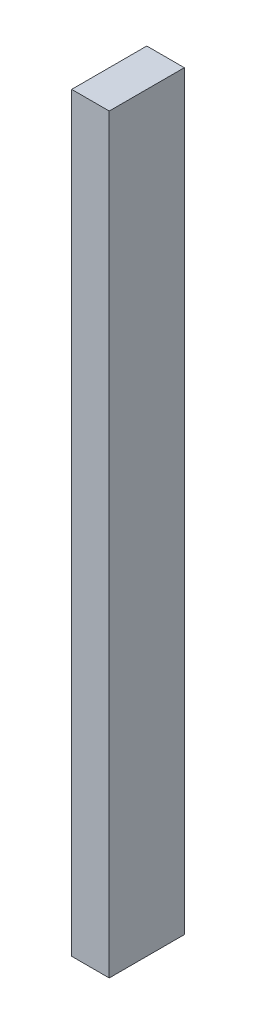
ISO-10303-21;
HEADER;
FILE_DESCRIPTION(('STEP AP214'),'2;1');
FILE_NAME('part.step','',(''),(''),'','','');
FILE_SCHEMA(('AUTOMOTIVE_DESIGN { 1 0 10303 214 1 1 1 1 }'));
ENDSEC;
DATA;
#1=APPLICATION_CONTEXT('core data for automotive mechanical design processes');
#2=APPLICATION_PROTOCOL_DEFINITION('international standard','automotive_design',2000,#1);
#3=PRODUCT_CONTEXT('',#1,'mechanical');
#4=PRODUCT('Part','Part','',(#3));
#5=PRODUCT_RELATED_PRODUCT_CATEGORY('part','',(#4));
#6=PRODUCT_DEFINITION_FORMATION('','',#4);
#7=PRODUCT_DEFINITION_CONTEXT('part definition',#1,'design');
#8=PRODUCT_DEFINITION('design','',#6,#7);
#9=PRODUCT_DEFINITION_SHAPE('','',#8);
#10=(LENGTH_UNIT() NAMED_UNIT(*) SI_UNIT(.MILLI.,.METRE.));
#11=(NAMED_UNIT(*) PLANE_ANGLE_UNIT() SI_UNIT($,.RADIAN.));
#12=(NAMED_UNIT(*) SI_UNIT($,.STERADIAN.) SOLID_ANGLE_UNIT());
#13=UNCERTAINTY_MEASURE_WITH_UNIT(LENGTH_MEASURE(1.E-05),#10,'distance_accuracy_value','');
#14=(GEOMETRIC_REPRESENTATION_CONTEXT(3) GLOBAL_UNCERTAINTY_ASSIGNED_CONTEXT((#13)) GLOBAL_UNIT_ASSIGNED_CONTEXT((#10,
#11,#12)) REPRESENTATION_CONTEXT('',''));
#15=CARTESIAN_POINT('',(0.,0.,0.));
#16=DIRECTION('',(0.,0.,1.));
#17=DIRECTION('',(1.,0.,0.));
#18=AXIS2_PLACEMENT_3D('',#15,#16,#17);
#19=CARTESIAN_POINT('',(-12.5,550.,-25.));
#20=DIRECTION('',(1.,0.,0.));
#21=DIRECTION('',(0.,0.,-1.));
#22=AXIS2_PLACEMENT_3D('',#19,#20,#21);
#23=PLANE('',#22);
#24=DIRECTION('',(0.,0.,1.));
#25=VECTOR('',#24,1.);
#26=CARTESIAN_POINT('',(-12.5,500.,-25.));
#27=LINE('',#26,#25);
#28=CARTESIAN_POINT('',(-12.5,500.,-25.));
#29=VERTEX_POINT('',#28);
#30=CARTESIAN_POINT('',(-12.5,500.,25.));
#31=VERTEX_POINT('',#30);
#32=EDGE_CURVE('E83',#29,#31,#27,.T.);
#33=ORIENTED_EDGE('',*,*,#32,.F.);
#34=DIRECTION('',(0.,-1.,0.));
#35=VECTOR('',#34,1.);
#36=CARTESIAN_POINT('',(-12.5,550.,-25.));
#37=LINE('',#36,#35);
#38=CARTESIAN_POINT('',(-12.5,0.,-25.));
#39=VERTEX_POINT('',#38);
#40=EDGE_CURVE('E65',#29,#39,#37,.T.);
#41=ORIENTED_EDGE('',*,*,#40,.T.);
#42=DIRECTION('',(0.,0.,1.));
#43=VECTOR('',#42,1.);
#44=CARTESIAN_POINT('',(-12.5,0.,-25.));
#45=LINE('',#44,#43);
#46=CARTESIAN_POINT('',(-12.5,0.,25.));
#47=VERTEX_POINT('',#46);
#48=EDGE_CURVE('E119',#39,#47,#45,.T.);
#49=ORIENTED_EDGE('',*,*,#48,.T.);
#50=DIRECTION('',(0.,-1.,0.));
#51=VECTOR('',#50,1.);
#52=CARTESIAN_POINT('',(-12.5,550.,25.));
#53=LINE('',#52,#51);
#54=EDGE_CURVE('E11',#31,#47,#53,.T.);
#55=ORIENTED_EDGE('',*,*,#54,.F.);
#56=EDGE_LOOP('',(#33,#41,#49,#55));
#57=FACE_BOUND('',#56,.T.);
#58=ADVANCED_FACE('F42',(#57),#23,.F.);
#59=CARTESIAN_POINT('',(12.5,550.,25.));
#60=DIRECTION('',(0.,0.,-1.));
#61=DIRECTION('',(-1.,0.,0.));
#62=AXIS2_PLACEMENT_3D('',#59,#60,#61);
#63=PLANE('',#62);
#64=DIRECTION('',(1.,0.,0.));
#65=VECTOR('',#64,1.);
#66=CARTESIAN_POINT('',(-12.5,500.,25.));
#67=LINE('',#66,#65);
#68=CARTESIAN_POINT('',(12.5,500.,25.));
#69=VERTEX_POINT('',#68);
#70=EDGE_CURVE('E91',#31,#69,#67,.T.);
#71=ORIENTED_EDGE('',*,*,#70,.F.);
#72=ORIENTED_EDGE('',*,*,#54,.T.);
#73=DIRECTION('',(1.,0.,0.));
#74=VECTOR('',#73,1.);
#75=CARTESIAN_POINT('',(12.5,0.,25.));
#76=LINE('',#75,#74);
#77=CARTESIAN_POINT('',(12.5,0.,25.));
#78=VERTEX_POINT('',#77);
#79=EDGE_CURVE('E115',#47,#78,#76,.T.);
#80=ORIENTED_EDGE('',*,*,#79,.T.);
#81=DIRECTION('',(0.,-1.,0.));
#82=VECTOR('',#81,1.);
#83=CARTESIAN_POINT('',(12.5,550.,25.));
#84=LINE('',#83,#82);
#85=EDGE_CURVE('E50',#69,#78,#84,.T.);
#86=ORIENTED_EDGE('',*,*,#85,.F.);
#87=EDGE_LOOP('',(#71,#72,#80,#86));
#88=FACE_BOUND('',#87,.T.);
#89=ADVANCED_FACE('F116',(#88),#63,.F.);
#90=CARTESIAN_POINT('',(12.5,550.,-25.));
#91=DIRECTION('',(-1.,0.,0.));
#92=DIRECTION('',(0.,0.,1.));
#93=AXIS2_PLACEMENT_3D('',#90,#91,#92);
#94=PLANE('',#93);
#95=DIRECTION('',(0.,0.,-1.));
#96=VECTOR('',#95,1.);
#97=CARTESIAN_POINT('',(12.5,500.,25.));
#98=LINE('',#97,#96);
#99=CARTESIAN_POINT('',(12.5,500.,-25.));
#100=VERTEX_POINT('',#99);
#101=EDGE_CURVE('E57',#69,#100,#98,.T.);
#102=ORIENTED_EDGE('',*,*,#101,.F.);
#103=ORIENTED_EDGE('',*,*,#85,.T.);
#104=DIRECTION('',(0.,0.,-1.));
#105=VECTOR('',#104,1.);
#106=CARTESIAN_POINT('',(12.5,0.,-25.));
#107=LINE('',#106,#105);
#108=CARTESIAN_POINT('',(12.5,0.,-25.));
#109=VERTEX_POINT('',#108);
#110=EDGE_CURVE('E103',#78,#109,#107,.T.);
#111=ORIENTED_EDGE('',*,*,#110,.T.);
#112=DIRECTION('',(0.,-1.,0.));
#113=VECTOR('',#112,1.);
#114=CARTESIAN_POINT('',(12.5,550.,-25.));
#115=LINE('',#114,#113);
#116=EDGE_CURVE('E98',#100,#109,#115,.T.);
#117=ORIENTED_EDGE('',*,*,#116,.F.);
#118=EDGE_LOOP('',(#102,#103,#111,#117));
#119=FACE_BOUND('',#118,.T.);
#120=ADVANCED_FACE('F111',(#119),#94,.F.);
#121=CARTESIAN_POINT('',(12.5,550.,-25.));
#122=DIRECTION('',(0.,0.,1.));
#123=DIRECTION('',(1.,0.,0.));
#124=AXIS2_PLACEMENT_3D('',#121,#122,#123);
#125=PLANE('',#124);
#126=DIRECTION('',(-1.,0.,0.));
#127=VECTOR('',#126,1.);
#128=CARTESIAN_POINT('',(12.5,500.,-25.));
#129=LINE('',#128,#127);
#130=EDGE_CURVE('E81',#100,#29,#129,.T.);
#131=ORIENTED_EDGE('',*,*,#130,.F.);
#132=ORIENTED_EDGE('',*,*,#116,.T.);
#133=DIRECTION('',(-1.,0.,0.));
#134=VECTOR('',#133,1.);
#135=CARTESIAN_POINT('',(12.5,0.,-25.));
#136=LINE('',#135,#134);
#137=EDGE_CURVE('E95',#109,#39,#136,.T.);
#138=ORIENTED_EDGE('',*,*,#137,.T.);
#139=ORIENTED_EDGE('',*,*,#40,.F.);
#140=EDGE_LOOP('',(#131,#132,#138,#139));
#141=FACE_BOUND('',#140,.T.);
#142=ADVANCED_FACE('F93',(#141),#125,.F.);
#143=CARTESIAN_POINT('',(0.,0.,0.));
#144=DIRECTION('',(0.,-1.,0.));
#145=DIRECTION('',(0.,0.,-1.));
#146=AXIS2_PLACEMENT_3D('',#143,#144,#145);
#147=PLANE('',#146);
#148=CARTESIAN_POINT('',(0.,0.,0.));
#149=DIRECTION('',(0.,-1.,0.));
#150=DIRECTION('',(0.,0.,-1.));
#151=AXIS2_PLACEMENT_3D('',#148,#149,#150);
#152=CIRCLE('',#151,4.);
#153=CARTESIAN_POINT('',(0.,0.,-4.));
#154=VERTEX_POINT('',#153);
#155=EDGE_CURVE('E127',#154,#154,#152,.T.);
#156=ORIENTED_EDGE('',*,*,#155,.F.);
#157=EDGE_LOOP('',(#156));
#158=FACE_BOUND('',#157,.T.);
#159=ORIENTED_EDGE('',*,*,#48,.F.);
#160=ORIENTED_EDGE('',*,*,#137,.F.);
#161=ORIENTED_EDGE('',*,*,#110,.F.);
#162=ORIENTED_EDGE('',*,*,#79,.F.);
#163=EDGE_LOOP('',(#159,#160,#161,#162));
#164=FACE_BOUND('',#163,.T.);
#165=ADVANCED_FACE('F121',(#158,#164),#147,.T.);
#166=CARTESIAN_POINT('',(0.,10.,0.));
#167=DIRECTION('',(0.,-1.,0.));
#168=DIRECTION('',(0.,0.,-1.));
#169=AXIS2_PLACEMENT_3D('',#166,#167,#168);
#170=CYLINDRICAL_SURFACE('',#169,4.);
#171=CARTESIAN_POINT('',(0.,10.,0.));
#172=DIRECTION('',(0.,-1.,0.));
#173=DIRECTION('',(0.,0.,-1.));
#174=AXIS2_PLACEMENT_3D('',#171,#172,#173);
#175=CIRCLE('',#174,4.);
#176=CARTESIAN_POINT('',(0.,10.,-4.));
#177=VERTEX_POINT('',#176);
#178=EDGE_CURVE('E126',#177,#177,#175,.T.);
#179=ORIENTED_EDGE('',*,*,#178,.F.);
#180=EDGE_LOOP('',(#179));
#181=FACE_BOUND('',#180,.T.);
#182=ORIENTED_EDGE('',*,*,#155,.T.);
#183=EDGE_LOOP('',(#182));
#184=FACE_BOUND('',#183,.T.);
#185=ADVANCED_FACE('F141',(#181,#184),#170,.F.);
#186=CARTESIAN_POINT('',(0.,10.,0.));
#187=DIRECTION('',(0.,-1.,0.));
#188=DIRECTION('',(0.,0.,-1.));
#189=AXIS2_PLACEMENT_3D('',#186,#187,#188);
#190=PLANE('',#189);
#191=ORIENTED_EDGE('',*,*,#178,.T.);
#192=EDGE_LOOP('',(#191));
#193=FACE_BOUND('',#192,.T.);
#194=ADVANCED_FACE('F139',(#193),#190,.T.);
#195=CARTESIAN_POINT('',(0.,500.,0.));
#196=DIRECTION('',(0.,1.,0.));
#197=DIRECTION('',(0.,0.,1.));
#198=AXIS2_PLACEMENT_3D('',#195,#196,#197);
#199=PLANE('',#198);
#200=ORIENTED_EDGE('',*,*,#130,.T.);
#201=ORIENTED_EDGE('',*,*,#32,.T.);
#202=ORIENTED_EDGE('',*,*,#70,.T.);
#203=ORIENTED_EDGE('',*,*,#101,.T.);
#204=EDGE_LOOP('',(#200,#201,#202,#203));
#205=FACE_BOUND('',#204,.T.);
#206=ADVANCED_FACE('F82',(#205),#199,.T.);
#207=CLOSED_SHELL('',(#58,#89,#120,#142,#165,#185,#194,#206));
#208=MANIFOLD_SOLID_BREP('B2',#207);
#209=ADVANCED_BREP_SHAPE_REPRESENTATION('',(#18,#208),#14);
#210=SHAPE_DEFINITION_REPRESENTATION(#9,#209);
ENDSEC;
END-ISO-10303-21;
